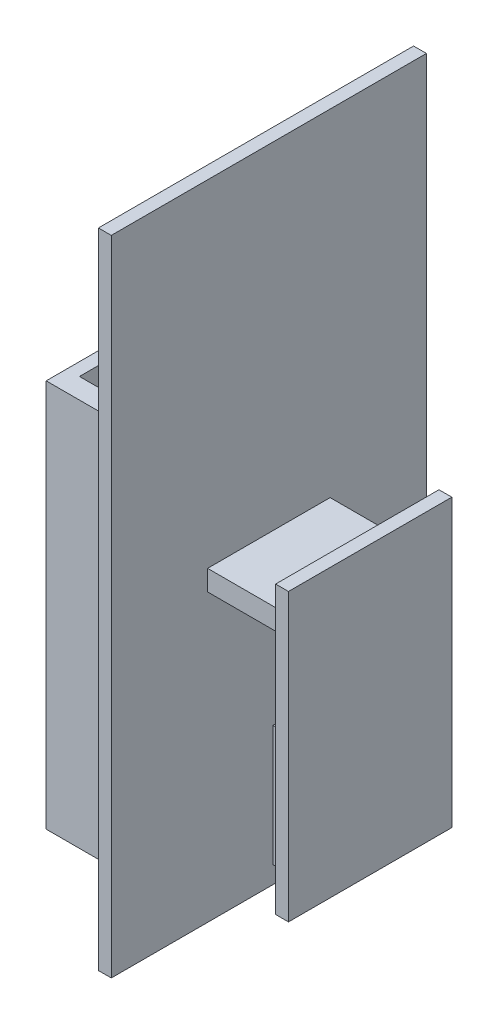
ISO-10303-21;
HEADER;
FILE_DESCRIPTION(('STEP AP214'),'2;1');
FILE_NAME('part.step','',(''),(''),'','','');
FILE_SCHEMA(('AUTOMOTIVE_DESIGN { 1 0 10303 214 1 1 1 1 }'));
ENDSEC;
DATA;
#1=APPLICATION_CONTEXT('core data for automotive mechanical design processes');
#2=APPLICATION_PROTOCOL_DEFINITION('international standard','automotive_design',2000,#1);
#3=PRODUCT_CONTEXT('',#1,'mechanical');
#4=PRODUCT('Part','Part','',(#3));
#5=PRODUCT_RELATED_PRODUCT_CATEGORY('part','',(#4));
#6=PRODUCT_DEFINITION_FORMATION('','',#4);
#7=PRODUCT_DEFINITION_CONTEXT('part definition',#1,'design');
#8=PRODUCT_DEFINITION('design','',#6,#7);
#9=PRODUCT_DEFINITION_SHAPE('','',#8);
#10=(LENGTH_UNIT() NAMED_UNIT(*) SI_UNIT(.MILLI.,.METRE.));
#11=(NAMED_UNIT(*) PLANE_ANGLE_UNIT() SI_UNIT($,.RADIAN.));
#12=(NAMED_UNIT(*) SI_UNIT($,.STERADIAN.) SOLID_ANGLE_UNIT());
#13=UNCERTAINTY_MEASURE_WITH_UNIT(LENGTH_MEASURE(1.E-05),#10,'distance_accuracy_value','');
#14=(GEOMETRIC_REPRESENTATION_CONTEXT(3) GLOBAL_UNCERTAINTY_ASSIGNED_CONTEXT((#13)) GLOBAL_UNIT_ASSIGNED_CONTEXT((#10,
#11,#12)) REPRESENTATION_CONTEXT('',''));
#15=CARTESIAN_POINT('',(0.,0.,0.));
#16=DIRECTION('',(0.,0.,1.));
#17=DIRECTION('',(1.,0.,0.));
#18=AXIS2_PLACEMENT_3D('',#15,#16,#17);
#19=CARTESIAN_POINT('',(-0.8,0.,0.));
#20=DIRECTION('',(1.,0.,0.));
#21=DIRECTION('',(0.,0.,-1.));
#22=AXIS2_PLACEMENT_3D('',#19,#20,#21);
#23=PLANE('',#22);
#24=DIRECTION('',(0.,-1.,0.));
#25=VECTOR('',#24,1.);
#26=CARTESIAN_POINT('',(-0.8,0.,10.16));
#27=LINE('',#26,#25);
#28=CARTESIAN_POINT('',(-0.8,13.38,10.16));
#29=VERTEX_POINT('',#28);
#30=CARTESIAN_POINT('',(-0.8,-34.92,10.16));
#31=VERTEX_POINT('',#30);
#32=EDGE_CURVE('E436',#29,#31,#27,.T.);
#33=ORIENTED_EDGE('',*,*,#32,.F.);
#34=DIRECTION('',(0.,0.,-1.));
#35=VECTOR('',#34,1.);
#36=CARTESIAN_POINT('',(-0.8,13.38,0.));
#37=LINE('',#36,#35);
#38=CARTESIAN_POINT('',(-0.8,13.38,12.7));
#39=VERTEX_POINT('',#38);
#40=EDGE_CURVE('E430',#39,#29,#37,.T.);
#41=ORIENTED_EDGE('',*,*,#40,.F.);
#42=DIRECTION('',(0.,-1.,0.));
#43=VECTOR('',#42,1.);
#44=CARTESIAN_POINT('',(-0.8,0.,12.7));
#45=LINE('',#44,#43);
#46=CARTESIAN_POINT('',(-0.8,-34.92,12.7));
#47=VERTEX_POINT('',#46);
#48=EDGE_CURVE('E433',#39,#47,#45,.T.);
#49=ORIENTED_EDGE('',*,*,#48,.T.);
#50=DIRECTION('',(0.,0.,-1.));
#51=VECTOR('',#50,1.);
#52=CARTESIAN_POINT('',(-0.8,-34.92,0.));
#53=LINE('',#52,#51);
#54=EDGE_CURVE('E58',#47,#31,#53,.T.);
#55=ORIENTED_EDGE('',*,*,#54,.T.);
#56=EDGE_LOOP('',(#33,#41,#49,#55));
#57=FACE_BOUND('',#56,.T.);
#58=DIRECTION('',(0.,0.,-1.));
#59=VECTOR('',#58,1.);
#60=CARTESIAN_POINT('',(-0.8,-40.,19.6));
#61=LINE('',#60,#59);
#62=CARTESIAN_POINT('',(-0.8,-40.,19.6));
#63=VERTEX_POINT('',#62);
#64=CARTESIAN_POINT('',(-0.8,-40.,-19.6));
#65=VERTEX_POINT('',#64);
#66=EDGE_CURVE('E402',#63,#65,#61,.T.);
#67=ORIENTED_EDGE('',*,*,#66,.F.);
#68=DIRECTION('',(0.,1.,0.));
#69=VECTOR('',#68,1.);
#70=CARTESIAN_POINT('',(-0.8,-40.,19.6));
#71=LINE('',#70,#69);
#72=CARTESIAN_POINT('',(-0.8,40.,19.6));
#73=VERTEX_POINT('',#72);
#74=EDGE_CURVE('E410',#63,#73,#71,.T.);
#75=ORIENTED_EDGE('',*,*,#74,.T.);
#76=DIRECTION('',(0.,0.,-1.));
#77=VECTOR('',#76,1.);
#78=CARTESIAN_POINT('',(-0.8,40.,19.6));
#79=LINE('',#78,#77);
#80=CARTESIAN_POINT('',(-0.8,40.,-19.6));
#81=VERTEX_POINT('',#80);
#82=EDGE_CURVE('E408',#73,#81,#79,.T.);
#83=ORIENTED_EDGE('',*,*,#82,.T.);
#84=DIRECTION('',(0.,1.,0.));
#85=VECTOR('',#84,1.);
#86=CARTESIAN_POINT('',(-0.8,-40.,-19.6));
#87=LINE('',#86,#85);
#88=EDGE_CURVE('E405',#65,#81,#87,.T.);
#89=ORIENTED_EDGE('',*,*,#88,.F.);
#90=EDGE_LOOP('',(#67,#75,#83,#89));
#91=FACE_BOUND('',#90,.T.);
#92=DIRECTION('',(0.,0.,-1.));
#93=VECTOR('',#92,1.);
#94=CARTESIAN_POINT('',(-0.8,13.38,0.));
#95=LINE('',#94,#93);
#96=CARTESIAN_POINT('',(-0.8,13.38,-10.16));
#97=VERTEX_POINT('',#96);
#98=CARTESIAN_POINT('',(-0.8,13.38,-12.7));
#99=VERTEX_POINT('',#98);
#100=EDGE_CURVE('E11',#97,#99,#95,.T.);
#101=ORIENTED_EDGE('',*,*,#100,.F.);
#102=DIRECTION('',(0.,-1.,0.));
#103=VECTOR('',#102,1.);
#104=CARTESIAN_POINT('',(-0.8,0.,-10.16));
#105=LINE('',#104,#103);
#106=CARTESIAN_POINT('',(-0.8,-34.92,-10.16));
#107=VERTEX_POINT('',#106);
#108=EDGE_CURVE('E438',#97,#107,#105,.T.);
#109=ORIENTED_EDGE('',*,*,#108,.T.);
#110=DIRECTION('',(0.,0.,-1.));
#111=VECTOR('',#110,1.);
#112=CARTESIAN_POINT('',(-0.8,-34.92,0.));
#113=LINE('',#112,#111);
#114=CARTESIAN_POINT('',(-0.8,-34.92,-12.7));
#115=VERTEX_POINT('',#114);
#116=EDGE_CURVE('E441',#107,#115,#113,.T.);
#117=ORIENTED_EDGE('',*,*,#116,.T.);
#118=DIRECTION('',(0.,-1.,0.));
#119=VECTOR('',#118,1.);
#120=CARTESIAN_POINT('',(-0.8,0.,-12.7));
#121=LINE('',#120,#119);
#122=EDGE_CURVE('E43',#99,#115,#121,.T.);
#123=ORIENTED_EDGE('',*,*,#122,.F.);
#124=EDGE_LOOP('',(#101,#109,#117,#123));
#125=FACE_BOUND('',#124,.T.);
#126=ADVANCED_FACE('F35',(#57,#91,#125),#23,.F.);
#127=CARTESIAN_POINT('',(11.8,0.,0.));
#128=DIRECTION('',(1.,0.,0.));
#129=DIRECTION('',(0.,0.,-1.));
#130=AXIS2_PLACEMENT_3D('',#127,#128,#129);
#131=PLANE('',#130);
#132=DIRECTION('',(0.,-1.,0.));
#133=VECTOR('',#132,1.);
#134=CARTESIAN_POINT('',(11.8,0.,10.16));
#135=LINE('',#134,#133);
#136=CARTESIAN_POINT('',(11.8,3.21999999999999,10.16));
#137=VERTEX_POINT('',#136);
#138=CARTESIAN_POINT('',(11.8,-32.38,10.16));
#139=VERTEX_POINT('',#138);
#140=EDGE_CURVE('E338',#137,#139,#135,.T.);
#141=ORIENTED_EDGE('',*,*,#140,.F.);
#142=DIRECTION('',(0.,0.,1.));
#143=VECTOR('',#142,1.);
#144=CARTESIAN_POINT('',(11.8,3.21999999999999,0.));
#145=LINE('',#144,#143);
#146=CARTESIAN_POINT('',(11.8,3.21999999999999,-10.16));
#147=VERTEX_POINT('',#146);
#148=EDGE_CURVE('E342',#147,#137,#145,.T.);
#149=ORIENTED_EDGE('',*,*,#148,.F.);
#150=DIRECTION('',(0.,-1.,0.));
#151=VECTOR('',#150,1.);
#152=CARTESIAN_POINT('',(11.8,0.,-10.16));
#153=LINE('',#152,#151);
#154=CARTESIAN_POINT('',(11.8,-32.38,-10.16));
#155=VERTEX_POINT('',#154);
#156=EDGE_CURVE('E356',#147,#155,#153,.T.);
#157=ORIENTED_EDGE('',*,*,#156,.T.);
#158=DIRECTION('',(0.,0.,1.));
#159=VECTOR('',#158,1.);
#160=CARTESIAN_POINT('',(11.8,-32.38,0.));
#161=LINE('',#160,#159);
#162=EDGE_CURVE('E353',#155,#139,#161,.T.);
#163=ORIENTED_EDGE('',*,*,#162,.T.);
#164=EDGE_LOOP('',(#141,#149,#157,#163));
#165=FACE_BOUND('',#164,.T.);
#166=DIRECTION('',(0.,0.,-1.));
#167=VECTOR('',#166,1.);
#168=CARTESIAN_POINT('',(11.8,-1.86000000000001,7.61999999999999));
#169=LINE('',#168,#167);
#170=CARTESIAN_POINT('',(11.8,-1.86000000000001,7.61999999999999));
#171=VERTEX_POINT('',#170);
#172=CARTESIAN_POINT('',(11.8,-1.86000000000001,-7.62000000000001));
#173=VERTEX_POINT('',#172);
#174=EDGE_CURVE('E368',#171,#173,#169,.T.);
#175=ORIENTED_EDGE('',*,*,#174,.F.);
#176=DIRECTION('',(0.,-1.,0.));
#177=VECTOR('',#176,1.);
#178=CARTESIAN_POINT('',(11.8,-1.86000000000001,7.61999999999999));
#179=LINE('',#178,#177);
#180=CARTESIAN_POINT('',(11.8,-4.40000000000001,7.61999999999999));
#181=VERTEX_POINT('',#180);
#182=EDGE_CURVE('E376',#171,#181,#179,.T.);
#183=ORIENTED_EDGE('',*,*,#182,.T.);
#184=DIRECTION('',(0.,0.,-1.));
#185=VECTOR('',#184,1.);
#186=CARTESIAN_POINT('',(11.8,-4.40000000000001,7.61999999999999));
#187=LINE('',#186,#185);
#188=CARTESIAN_POINT('',(11.8,-4.40000000000001,-7.62000000000001));
#189=VERTEX_POINT('',#188);
#190=EDGE_CURVE('E374',#181,#189,#187,.T.);
#191=ORIENTED_EDGE('',*,*,#190,.T.);
#192=DIRECTION('',(0.,-1.,0.));
#193=VECTOR('',#192,1.);
#194=CARTESIAN_POINT('',(11.8,-1.86000000000001,-7.62000000000001));
#195=LINE('',#194,#193);
#196=EDGE_CURVE('E371',#173,#189,#195,.T.);
#197=ORIENTED_EDGE('',*,*,#196,.F.);
#198=EDGE_LOOP('',(#175,#183,#191,#197));
#199=FACE_BOUND('',#198,.T.);
#200=DIRECTION('',(0.,0.,-1.));
#201=VECTOR('',#200,1.);
#202=CARTESIAN_POINT('',(11.8,-14.84,7.49999999999999));
#203=LINE('',#202,#201);
#204=CARTESIAN_POINT('',(11.8,-14.84,7.49999999999999));
#205=VERTEX_POINT('',#204);
#206=CARTESIAN_POINT('',(11.8,-14.84,-7.50000000000001));
#207=VERTEX_POINT('',#206);
#208=EDGE_CURVE('E298',#205,#207,#203,.T.);
#209=ORIENTED_EDGE('',*,*,#208,.F.);
#210=DIRECTION('',(0.,-1.,0.));
#211=VECTOR('',#210,1.);
#212=CARTESIAN_POINT('',(11.8,-14.84,7.49999999999999));
#213=LINE('',#212,#211);
#214=CARTESIAN_POINT('',(11.8,-29.84,7.49999999999999));
#215=VERTEX_POINT('',#214);
#216=EDGE_CURVE('E311',#205,#215,#213,.T.);
#217=ORIENTED_EDGE('',*,*,#216,.T.);
#218=DIRECTION('',(0.,0.,-1.));
#219=VECTOR('',#218,1.);
#220=CARTESIAN_POINT('',(11.8,-29.84,7.49999999999999));
#221=LINE('',#220,#219);
#222=CARTESIAN_POINT('',(11.8,-29.84,-7.50000000000001));
#223=VERTEX_POINT('',#222);
#224=EDGE_CURVE('E325',#215,#223,#221,.T.);
#225=ORIENTED_EDGE('',*,*,#224,.T.);
#226=DIRECTION('',(0.,-1.,0.));
#227=VECTOR('',#226,1.);
#228=CARTESIAN_POINT('',(11.8,-14.84,-7.50000000000001));
#229=LINE('',#228,#227);
#230=EDGE_CURVE('E322',#207,#223,#229,.T.);
#231=ORIENTED_EDGE('',*,*,#230,.F.);
#232=EDGE_LOOP('',(#209,#217,#225,#231));
#233=FACE_BOUND('',#232,.T.);
#234=ADVANCED_FACE('F484',(#165,#199,#233),#131,.F.);
#235=CARTESIAN_POINT('',(-0.8,-40.,19.6));
#236=DIRECTION('',(0.,-1.,0.));
#237=DIRECTION('',(0.,0.,-1.));
#238=AXIS2_PLACEMENT_3D('',#235,#236,#237);
#239=PLANE('',#238);
#240=DIRECTION('',(1.,0.,0.));
#241=VECTOR('',#240,1.);
#242=CARTESIAN_POINT('',(-0.8,-40.,-19.6));
#243=LINE('',#242,#241);
#244=CARTESIAN_POINT('',(0.8,-40.,-19.6));
#245=VERTEX_POINT('',#244);
#246=EDGE_CURVE('E412',#65,#245,#243,.T.);
#247=ORIENTED_EDGE('',*,*,#246,.T.);
#248=DIRECTION('',(0.,0.,-1.));
#249=VECTOR('',#248,1.);
#250=CARTESIAN_POINT('',(0.8,-40.,19.6));
#251=LINE('',#250,#249);
#252=CARTESIAN_POINT('',(0.8,-40.,19.6));
#253=VERTEX_POINT('',#252);
#254=EDGE_CURVE('E382',#253,#245,#251,.T.);
#255=ORIENTED_EDGE('',*,*,#254,.F.);
#256=DIRECTION('',(1.,0.,0.));
#257=VECTOR('',#256,1.);
#258=CARTESIAN_POINT('',(-0.8,-40.,19.6));
#259=LINE('',#258,#257);
#260=EDGE_CURVE('E413',#63,#253,#259,.T.);
#261=ORIENTED_EDGE('',*,*,#260,.F.);
#262=ORIENTED_EDGE('',*,*,#66,.T.);
#263=EDGE_LOOP('',(#247,#255,#261,#262));
#264=FACE_BOUND('',#263,.T.);
#265=ADVANCED_FACE('F37',(#264),#239,.T.);
#266=CARTESIAN_POINT('',(-0.8,-40.,19.6));
#267=DIRECTION('',(0.,0.,-1.));
#268=DIRECTION('',(-1.,0.,0.));
#269=AXIS2_PLACEMENT_3D('',#266,#267,#268);
#270=PLANE('',#269);
#271=ORIENTED_EDGE('',*,*,#260,.T.);
#272=DIRECTION('',(0.,1.,0.));
#273=VECTOR('',#272,1.);
#274=CARTESIAN_POINT('',(0.8,-40.,19.6));
#275=LINE('',#274,#273);
#276=CARTESIAN_POINT('',(0.8,40.,19.6));
#277=VERTEX_POINT('',#276);
#278=EDGE_CURVE('E399',#253,#277,#275,.T.);
#279=ORIENTED_EDGE('',*,*,#278,.T.);
#280=DIRECTION('',(1.,0.,0.));
#281=VECTOR('',#280,1.);
#282=CARTESIAN_POINT('',(-0.8,40.,19.6));
#283=LINE('',#282,#281);
#284=EDGE_CURVE('E416',#73,#277,#283,.T.);
#285=ORIENTED_EDGE('',*,*,#284,.F.);
#286=ORIENTED_EDGE('',*,*,#74,.F.);
#287=EDGE_LOOP('',(#271,#279,#285,#286));
#288=FACE_BOUND('',#287,.T.);
#289=ADVANCED_FACE('F495',(#288),#270,.F.);
#290=CARTESIAN_POINT('',(-0.8,40.,19.6));
#291=DIRECTION('',(0.,-1.,0.));
#292=DIRECTION('',(0.,0.,-1.));
#293=AXIS2_PLACEMENT_3D('',#290,#291,#292);
#294=PLANE('',#293);
#295=ORIENTED_EDGE('',*,*,#284,.T.);
#296=DIRECTION('',(0.,0.,-1.));
#297=VECTOR('',#296,1.);
#298=CARTESIAN_POINT('',(0.8,40.,19.6));
#299=LINE('',#298,#297);
#300=CARTESIAN_POINT('',(0.8,40.,-19.6));
#301=VERTEX_POINT('',#300);
#302=EDGE_CURVE('E396',#277,#301,#299,.T.);
#303=ORIENTED_EDGE('',*,*,#302,.T.);
#304=DIRECTION('',(1.,0.,0.));
#305=VECTOR('',#304,1.);
#306=CARTESIAN_POINT('',(-0.8,40.,-19.6));
#307=LINE('',#306,#305);
#308=EDGE_CURVE('E418',#81,#301,#307,.T.);
#309=ORIENTED_EDGE('',*,*,#308,.F.);
#310=ORIENTED_EDGE('',*,*,#82,.F.);
#311=EDGE_LOOP('',(#295,#303,#309,#310));
#312=FACE_BOUND('',#311,.T.);
#313=ADVANCED_FACE('F498',(#312),#294,.F.);
#314=CARTESIAN_POINT('',(-0.8,-40.,-19.6));
#315=DIRECTION('',(0.,0.,-1.));
#316=DIRECTION('',(-1.,0.,0.));
#317=AXIS2_PLACEMENT_3D('',#314,#315,#316);
#318=PLANE('',#317);
#319=ORIENTED_EDGE('',*,*,#308,.T.);
#320=DIRECTION('',(0.,1.,0.));
#321=VECTOR('',#320,1.);
#322=CARTESIAN_POINT('',(0.8,-40.,-19.6));
#323=LINE('',#322,#321);
#324=EDGE_CURVE('E393',#245,#301,#323,.T.);
#325=ORIENTED_EDGE('',*,*,#324,.F.);
#326=ORIENTED_EDGE('',*,*,#246,.F.);
#327=ORIENTED_EDGE('',*,*,#88,.T.);
#328=EDGE_LOOP('',(#319,#325,#326,#327));
#329=FACE_BOUND('',#328,.T.);
#330=ADVANCED_FACE('F501',(#329),#318,.T.);
#331=CARTESIAN_POINT('',(0.8,0.,0.));
#332=DIRECTION('',(1.,0.,0.));
#333=DIRECTION('',(0.,0.,-1.));
#334=AXIS2_PLACEMENT_3D('',#331,#332,#333);
#335=PLANE('',#334);
#336=DIRECTION('',(0.,0.,1.));
#337=VECTOR('',#336,1.);
#338=CARTESIAN_POINT('',(0.8,-1.86000000000001,0.));
#339=LINE('',#338,#337);
#340=CARTESIAN_POINT('',(0.8,-1.86000000000001,-7.62000000000001));
#341=VERTEX_POINT('',#340);
#342=CARTESIAN_POINT('',(0.8,-1.86000000000001,7.61999999999999));
#343=VERTEX_POINT('',#342);
#344=EDGE_CURVE('E427',#341,#343,#339,.T.);
#345=ORIENTED_EDGE('',*,*,#344,.F.);
#346=DIRECTION('',(0.,1.,0.));
#347=VECTOR('',#346,1.);
#348=CARTESIAN_POINT('',(0.8,0.,-7.62000000000001));
#349=LINE('',#348,#347);
#350=CARTESIAN_POINT('',(0.8,-4.40000000000001,-7.62000000000001));
#351=VERTEX_POINT('',#350);
#352=EDGE_CURVE('E415',#351,#341,#349,.T.);
#353=ORIENTED_EDGE('',*,*,#352,.F.);
#354=DIRECTION('',(0.,0.,1.));
#355=VECTOR('',#354,1.);
#356=CARTESIAN_POINT('',(0.8,-4.40000000000001,0.));
#357=LINE('',#356,#355);
#358=CARTESIAN_POINT('',(0.8,-4.40000000000001,7.61999999999999));
#359=VERTEX_POINT('',#358);
#360=EDGE_CURVE('E423',#351,#359,#357,.T.);
#361=ORIENTED_EDGE('',*,*,#360,.T.);
#362=DIRECTION('',(0.,1.,0.));
#363=VECTOR('',#362,1.);
#364=CARTESIAN_POINT('',(0.8,0.,7.61999999999999));
#365=LINE('',#364,#363);
#366=EDGE_CURVE('E425',#359,#343,#365,.T.);
#367=ORIENTED_EDGE('',*,*,#366,.T.);
#368=EDGE_LOOP('',(#345,#353,#361,#367));
#369=FACE_BOUND('',#368,.T.);
#370=ORIENTED_EDGE('',*,*,#254,.T.);
#371=ORIENTED_EDGE('',*,*,#324,.T.);
#372=ORIENTED_EDGE('',*,*,#302,.F.);
#373=ORIENTED_EDGE('',*,*,#278,.F.);
#374=EDGE_LOOP('',(#370,#371,#372,#373));
#375=FACE_BOUND('',#374,.T.);
#376=ADVANCED_FACE('F493',(#369,#375),#335,.T.);
#377=CARTESIAN_POINT('',(11.8,-1.86000000000001,7.61999999999999));
#378=DIRECTION('',(0.,1.,0.));
#379=DIRECTION('',(0.,0.,1.));
#380=AXIS2_PLACEMENT_3D('',#377,#378,#379);
#381=PLANE('',#380);
#382=DIRECTION('',(-1.,0.,0.));
#383=VECTOR('',#382,1.);
#384=CARTESIAN_POINT('',(11.8,-1.86000000000001,-7.62000000000001));
#385=LINE('',#384,#383);
#386=EDGE_CURVE('E378',#173,#341,#385,.T.);
#387=ORIENTED_EDGE('',*,*,#386,.T.);
#388=ORIENTED_EDGE('',*,*,#344,.T.);
#389=DIRECTION('',(-1.,0.,0.));
#390=VECTOR('',#389,1.);
#391=CARTESIAN_POINT('',(11.8,-1.86000000000001,7.61999999999999));
#392=LINE('',#391,#390);
#393=EDGE_CURVE('E379',#171,#343,#392,.T.);
#394=ORIENTED_EDGE('',*,*,#393,.F.);
#395=ORIENTED_EDGE('',*,*,#174,.T.);
#396=EDGE_LOOP('',(#387,#388,#394,#395));
#397=FACE_BOUND('',#396,.T.);
#398=ADVANCED_FACE('F508',(#397),#381,.T.);
#399=CARTESIAN_POINT('',(11.8,-1.86000000000001,7.61999999999999));
#400=DIRECTION('',(0.,0.,-1.));
#401=DIRECTION('',(-1.,0.,0.));
#402=AXIS2_PLACEMENT_3D('',#399,#400,#401);
#403=PLANE('',#402);
#404=ORIENTED_EDGE('',*,*,#366,.F.);
#405=DIRECTION('',(-1.,0.,0.));
#406=VECTOR('',#405,1.);
#407=CARTESIAN_POINT('',(11.8,-4.40000000000001,7.61999999999999));
#408=LINE('',#407,#406);
#409=EDGE_CURVE('E383',#181,#359,#408,.T.);
#410=ORIENTED_EDGE('',*,*,#409,.F.);
#411=ORIENTED_EDGE('',*,*,#182,.F.);
#412=ORIENTED_EDGE('',*,*,#393,.T.);
#413=EDGE_LOOP('',(#404,#410,#411,#412));
#414=FACE_BOUND('',#413,.T.);
#415=ADVANCED_FACE('F554',(#414),#403,.F.);
#416=CARTESIAN_POINT('',(11.8,-4.40000000000001,7.61999999999999));
#417=DIRECTION('',(0.,1.,0.));
#418=DIRECTION('',(0.,0.,1.));
#419=AXIS2_PLACEMENT_3D('',#416,#417,#418);
#420=PLANE('',#419);
#421=ORIENTED_EDGE('',*,*,#360,.F.);
#422=DIRECTION('',(-1.,0.,0.));
#423=VECTOR('',#422,1.);
#424=CARTESIAN_POINT('',(11.8,-4.40000000000001,-7.62000000000001));
#425=LINE('',#424,#423);
#426=EDGE_CURVE('E386',#189,#351,#425,.T.);
#427=ORIENTED_EDGE('',*,*,#426,.F.);
#428=ORIENTED_EDGE('',*,*,#190,.F.);
#429=ORIENTED_EDGE('',*,*,#409,.T.);
#430=EDGE_LOOP('',(#421,#427,#428,#429));
#431=FACE_BOUND('',#430,.T.);
#432=ADVANCED_FACE('F563',(#431),#420,.F.);
#433=CARTESIAN_POINT('',(11.8,-1.86000000000001,-7.62000000000001));
#434=DIRECTION('',(0.,0.,-1.));
#435=DIRECTION('',(-1.,0.,0.));
#436=AXIS2_PLACEMENT_3D('',#433,#434,#435);
#437=PLANE('',#436);
#438=ORIENTED_EDGE('',*,*,#426,.T.);
#439=ORIENTED_EDGE('',*,*,#352,.T.);
#440=ORIENTED_EDGE('',*,*,#386,.F.);
#441=ORIENTED_EDGE('',*,*,#196,.T.);
#442=EDGE_LOOP('',(#438,#439,#440,#441));
#443=FACE_BOUND('',#442,.T.);
#444=ADVANCED_FACE('F573',(#443),#437,.T.);
#445=CARTESIAN_POINT('',(13.4,0.,10.16));
#446=DIRECTION('',(0.,0.,-1.));
#447=DIRECTION('',(0.,1.,0.));
#448=AXIS2_PLACEMENT_3D('',#445,#446,#447);
#449=PLANE('',#448);
#450=ORIENTED_EDGE('',*,*,#140,.T.);
#451=DIRECTION('',(-1.,0.,0.));
#452=VECTOR('',#451,1.);
#453=CARTESIAN_POINT('',(13.4,-32.38,10.16));
#454=LINE('',#453,#452);
#455=CARTESIAN_POINT('',(13.4,-32.38,10.16));
#456=VERTEX_POINT('',#455);
#457=EDGE_CURVE('E366',#456,#139,#454,.T.);
#458=ORIENTED_EDGE('',*,*,#457,.F.);
#459=DIRECTION('',(0.,-1.,0.));
#460=VECTOR('',#459,1.);
#461=CARTESIAN_POINT('',(13.4,0.,10.16));
#462=LINE('',#461,#460);
#463=CARTESIAN_POINT('',(13.4,3.21999999999999,10.16));
#464=VERTEX_POINT('',#463);
#465=EDGE_CURVE('E339',#464,#456,#462,.T.);
#466=ORIENTED_EDGE('',*,*,#465,.F.);
#467=DIRECTION('',(-1.,0.,0.));
#468=VECTOR('',#467,1.);
#469=CARTESIAN_POINT('',(13.4,3.21999999999999,10.16));
#470=LINE('',#469,#468);
#471=EDGE_CURVE('E350',#464,#137,#470,.T.);
#472=ORIENTED_EDGE('',*,*,#471,.T.);
#473=EDGE_LOOP('',(#450,#458,#466,#472));
#474=FACE_BOUND('',#473,.T.);
#475=ADVANCED_FACE('F583',(#474),#449,.F.);
#476=CARTESIAN_POINT('',(13.4,-32.38,0.));
#477=DIRECTION('',(0.,-1.,0.));
#478=DIRECTION('',(0.,0.,-1.));
#479=AXIS2_PLACEMENT_3D('',#476,#477,#478);
#480=PLANE('',#479);
#481=ORIENTED_EDGE('',*,*,#162,.F.);
#482=DIRECTION('',(-1.,0.,0.));
#483=VECTOR('',#482,1.);
#484=CARTESIAN_POINT('',(13.4,-32.38,-10.16));
#485=LINE('',#484,#483);
#486=CARTESIAN_POINT('',(13.4,-32.38,-10.16));
#487=VERTEX_POINT('',#486);
#488=EDGE_CURVE('E364',#487,#155,#485,.T.);
#489=ORIENTED_EDGE('',*,*,#488,.F.);
#490=DIRECTION('',(0.,0.,1.));
#491=VECTOR('',#490,1.);
#492=CARTESIAN_POINT('',(13.4,-32.38,0.));
#493=LINE('',#492,#491);
#494=EDGE_CURVE('E341',#487,#456,#493,.T.);
#495=ORIENTED_EDGE('',*,*,#494,.T.);
#496=ORIENTED_EDGE('',*,*,#457,.T.);
#497=EDGE_LOOP('',(#481,#489,#495,#496));
#498=FACE_BOUND('',#497,.T.);
#499=ADVANCED_FACE('F594',(#498),#480,.T.);
#500=CARTESIAN_POINT('',(13.4,0.,-10.16));
#501=DIRECTION('',(0.,0.,-1.));
#502=DIRECTION('',(0.,1.,0.));
#503=AXIS2_PLACEMENT_3D('',#500,#501,#502);
#504=PLANE('',#503);
#505=ORIENTED_EDGE('',*,*,#156,.F.);
#506=DIRECTION('',(-1.,0.,0.));
#507=VECTOR('',#506,1.);
#508=CARTESIAN_POINT('',(13.4,3.21999999999999,-10.16));
#509=LINE('',#508,#507);
#510=CARTESIAN_POINT('',(13.4,3.21999999999999,-10.16));
#511=VERTEX_POINT('',#510);
#512=EDGE_CURVE('E362',#511,#147,#509,.T.);
#513=ORIENTED_EDGE('',*,*,#512,.F.);
#514=DIRECTION('',(0.,-1.,0.));
#515=VECTOR('',#514,1.);
#516=CARTESIAN_POINT('',(13.4,0.,-10.16));
#517=LINE('',#516,#515);
#518=EDGE_CURVE('E345',#511,#487,#517,.T.);
#519=ORIENTED_EDGE('',*,*,#518,.T.);
#520=ORIENTED_EDGE('',*,*,#488,.T.);
#521=EDGE_LOOP('',(#505,#513,#519,#520));
#522=FACE_BOUND('',#521,.T.);
#523=ADVANCED_FACE('F604',(#522),#504,.T.);
#524=CARTESIAN_POINT('',(13.4,3.21999999999999,0.));
#525=DIRECTION('',(0.,-1.,0.));
#526=DIRECTION('',(0.,0.,-1.));
#527=AXIS2_PLACEMENT_3D('',#524,#525,#526);
#528=PLANE('',#527);
#529=ORIENTED_EDGE('',*,*,#148,.T.);
#530=ORIENTED_EDGE('',*,*,#471,.F.);
#531=DIRECTION('',(0.,0.,1.));
#532=VECTOR('',#531,1.);
#533=CARTESIAN_POINT('',(13.4,3.21999999999999,0.));
#534=LINE('',#533,#532);
#535=EDGE_CURVE('E348',#511,#464,#534,.T.);
#536=ORIENTED_EDGE('',*,*,#535,.F.);
#537=ORIENTED_EDGE('',*,*,#512,.T.);
#538=EDGE_LOOP('',(#529,#530,#536,#537));
#539=FACE_BOUND('',#538,.T.);
#540=ADVANCED_FACE('F615',(#539),#528,.F.);
#541=CARTESIAN_POINT('',(13.4,0.,0.));
#542=DIRECTION('',(1.,0.,0.));
#543=DIRECTION('',(0.,0.,-1.));
#544=AXIS2_PLACEMENT_3D('',#541,#542,#543);
#545=PLANE('',#544);
#546=ORIENTED_EDGE('',*,*,#465,.T.);
#547=ORIENTED_EDGE('',*,*,#494,.F.);
#548=ORIENTED_EDGE('',*,*,#518,.F.);
#549=ORIENTED_EDGE('',*,*,#535,.T.);
#550=EDGE_LOOP('',(#546,#547,#548,#549));
#551=FACE_BOUND('',#550,.T.);
#552=ADVANCED_FACE('F625',(#551),#545,.T.);
#553=CARTESIAN_POINT('',(8.8,-14.84,7.49999999999999));
#554=DIRECTION('',(0.,-1.,0.));
#555=DIRECTION('',(0.,0.,-1.));
#556=AXIS2_PLACEMENT_3D('',#553,#554,#555);
#557=PLANE('',#556);
#558=ORIENTED_EDGE('',*,*,#208,.T.);
#559=DIRECTION('',(1.,0.,0.));
#560=VECTOR('',#559,1.);
#561=CARTESIAN_POINT('',(8.8,-14.84,-7.50000000000001));
#562=LINE('',#561,#560);
#563=CARTESIAN_POINT('',(8.8,-14.84,-7.50000000000001));
#564=VERTEX_POINT('',#563);
#565=EDGE_CURVE('E336',#564,#207,#562,.T.);
#566=ORIENTED_EDGE('',*,*,#565,.F.);
#567=DIRECTION('',(0.,0.,-1.));
#568=VECTOR('',#567,1.);
#569=CARTESIAN_POINT('',(8.8,-14.84,7.49999999999999));
#570=LINE('',#569,#568);
#571=CARTESIAN_POINT('',(8.8,-14.84,7.49999999999999));
#572=VERTEX_POINT('',#571);
#573=EDGE_CURVE('E307',#572,#564,#570,.T.);
#574=ORIENTED_EDGE('',*,*,#573,.F.);
#575=DIRECTION('',(1.,0.,0.));
#576=VECTOR('',#575,1.);
#577=CARTESIAN_POINT('',(8.8,-14.84,7.49999999999999));
#578=LINE('',#577,#576);
#579=EDGE_CURVE('E319',#572,#205,#578,.T.);
#580=ORIENTED_EDGE('',*,*,#579,.T.);
#581=EDGE_LOOP('',(#558,#566,#574,#580));
#582=FACE_BOUND('',#581,.T.);
#583=ADVANCED_FACE('F635',(#582),#557,.F.);
#584=CARTESIAN_POINT('',(8.8,-14.84,-7.50000000000001));
#585=DIRECTION('',(0.,0.,1.));
#586=DIRECTION('',(0.,-1.,0.));
#587=AXIS2_PLACEMENT_3D('',#584,#585,#586);
#588=PLANE('',#587);
#589=ORIENTED_EDGE('',*,*,#230,.T.);
#590=DIRECTION('',(1.,0.,0.));
#591=VECTOR('',#590,1.);
#592=CARTESIAN_POINT('',(8.8,-29.84,-7.50000000000001));
#593=LINE('',#592,#591);
#594=CARTESIAN_POINT('',(8.8,-29.84,-7.50000000000001));
#595=VERTEX_POINT('',#594);
#596=EDGE_CURVE('E334',#595,#223,#593,.T.);
#597=ORIENTED_EDGE('',*,*,#596,.F.);
#598=DIRECTION('',(0.,-1.,0.));
#599=VECTOR('',#598,1.);
#600=CARTESIAN_POINT('',(8.8,-14.84,-7.50000000000001));
#601=LINE('',#600,#599);
#602=EDGE_CURVE('E310',#564,#595,#601,.T.);
#603=ORIENTED_EDGE('',*,*,#602,.F.);
#604=ORIENTED_EDGE('',*,*,#565,.T.);
#605=EDGE_LOOP('',(#589,#597,#603,#604));
#606=FACE_BOUND('',#605,.T.);
#607=ADVANCED_FACE('F651',(#606),#588,.F.);
#608=CARTESIAN_POINT('',(8.8,-29.84,7.49999999999999));
#609=DIRECTION('',(0.,-1.,0.));
#610=DIRECTION('',(0.,0.,-1.));
#611=AXIS2_PLACEMENT_3D('',#608,#609,#610);
#612=PLANE('',#611);
#613=ORIENTED_EDGE('',*,*,#224,.F.);
#614=DIRECTION('',(1.,0.,0.));
#615=VECTOR('',#614,1.);
#616=CARTESIAN_POINT('',(8.8,-29.84,7.49999999999999));
#617=LINE('',#616,#615);
#618=CARTESIAN_POINT('',(8.8,-29.84,7.49999999999999));
#619=VERTEX_POINT('',#618);
#620=EDGE_CURVE('E331',#619,#215,#617,.T.);
#621=ORIENTED_EDGE('',*,*,#620,.F.);
#622=DIRECTION('',(0.,0.,-1.));
#623=VECTOR('',#622,1.);
#624=CARTESIAN_POINT('',(8.8,-29.84,7.49999999999999));
#625=LINE('',#624,#623);
#626=EDGE_CURVE('E313',#619,#595,#625,.T.);
#627=ORIENTED_EDGE('',*,*,#626,.T.);
#628=ORIENTED_EDGE('',*,*,#596,.T.);
#629=EDGE_LOOP('',(#613,#621,#627,#628));
#630=FACE_BOUND('',#629,.T.);
#631=ADVANCED_FACE('F661',(#630),#612,.T.);
#632=CARTESIAN_POINT('',(8.8,-14.84,7.49999999999999));
#633=DIRECTION('',(0.,0.,1.));
#634=DIRECTION('',(0.,-1.,0.));
#635=AXIS2_PLACEMENT_3D('',#632,#633,#634);
#636=PLANE('',#635);
#637=ORIENTED_EDGE('',*,*,#216,.F.);
#638=ORIENTED_EDGE('',*,*,#579,.F.);
#639=DIRECTION('',(0.,-1.,0.));
#640=VECTOR('',#639,1.);
#641=CARTESIAN_POINT('',(8.8,-14.84,7.49999999999999));
#642=LINE('',#641,#640);
#643=EDGE_CURVE('E316',#572,#619,#642,.T.);
#644=ORIENTED_EDGE('',*,*,#643,.T.);
#645=ORIENTED_EDGE('',*,*,#620,.T.);
#646=EDGE_LOOP('',(#637,#638,#644,#645));
#647=FACE_BOUND('',#646,.T.);
#648=ADVANCED_FACE('F671',(#647),#636,.T.);
#649=CARTESIAN_POINT('',(8.8,0.,0.));
#650=DIRECTION('',(-1.,0.,0.));
#651=DIRECTION('',(0.,0.,1.));
#652=AXIS2_PLACEMENT_3D('',#649,#650,#651);
#653=PLANE('',#652);
#654=ORIENTED_EDGE('',*,*,#573,.T.);
#655=ORIENTED_EDGE('',*,*,#602,.T.);
#656=ORIENTED_EDGE('',*,*,#626,.F.);
#657=ORIENTED_EDGE('',*,*,#643,.F.);
#658=EDGE_LOOP('',(#654,#655,#656,#657));
#659=FACE_BOUND('',#658,.T.);
#660=ADVANCED_FACE('F681',(#659),#653,.T.);
#661=CARTESIAN_POINT('',(-12.6,0.,10.16));
#662=DIRECTION('',(0.,0.,1.));
#663=DIRECTION('',(0.,-1.,0.));
#664=AXIS2_PLACEMENT_3D('',#661,#662,#663);
#665=PLANE('',#664);
#666=DIRECTION('',(1.,0.,0.));
#667=VECTOR('',#666,1.);
#668=CARTESIAN_POINT('',(-12.6,13.38,10.16));
#669=LINE('',#668,#667);
#670=CARTESIAN_POINT('',(-12.6,13.38,10.16));
#671=VERTEX_POINT('',#670);
#672=EDGE_CURVE('E294',#671,#29,#669,.T.);
#673=ORIENTED_EDGE('',*,*,#672,.T.);
#674=ORIENTED_EDGE('',*,*,#32,.T.);
#675=DIRECTION('',(1.,0.,0.));
#676=VECTOR('',#675,1.);
#677=CARTESIAN_POINT('',(-12.6,-34.92,10.16));
#678=LINE('',#677,#676);
#679=CARTESIAN_POINT('',(-12.6,-34.92,10.16));
#680=VERTEX_POINT('',#679);
#681=EDGE_CURVE('E295',#680,#31,#678,.T.);
#682=ORIENTED_EDGE('',*,*,#681,.F.);
#683=DIRECTION('',(0.,-1.,0.));
#684=VECTOR('',#683,1.);
#685=CARTESIAN_POINT('',(-12.6,0.,10.16));
#686=LINE('',#685,#684);
#687=EDGE_CURVE('E285',#671,#680,#686,.T.);
#688=ORIENTED_EDGE('',*,*,#687,.F.);
#689=EDGE_LOOP('',(#673,#674,#682,#688));
#690=FACE_BOUND('',#689,.T.);
#691=ADVANCED_FACE('F462',(#690),#665,.F.);
#692=CARTESIAN_POINT('',(-12.6,-34.92,0.));
#693=DIRECTION('',(0.,-1.,0.));
#694=DIRECTION('',(0.,0.,-1.));
#695=AXIS2_PLACEMENT_3D('',#692,#693,#694);
#696=PLANE('',#695);
#697=ORIENTED_EDGE('',*,*,#54,.F.);
#698=DIRECTION('',(1.,0.,0.));
#699=VECTOR('',#698,1.);
#700=CARTESIAN_POINT('',(-12.6,-34.92,12.7));
#701=LINE('',#700,#699);
#702=CARTESIAN_POINT('',(-14.2,-34.92,12.7));
#703=VERTEX_POINT('',#702);
#704=EDGE_CURVE('E299',#703,#47,#701,.T.);
#705=ORIENTED_EDGE('',*,*,#704,.F.);
#706=DIRECTION('',(0.,0.,-1.));
#707=VECTOR('',#706,1.);
#708=CARTESIAN_POINT('',(-14.2,-34.92,0.));
#709=LINE('',#708,#707);
#710=CARTESIAN_POINT('',(-14.2,-34.92,2.99999999999999));
#711=VERTEX_POINT('',#710);
#712=EDGE_CURVE('E256',#703,#711,#709,.T.);
#713=ORIENTED_EDGE('',*,*,#712,.T.);
#714=DIRECTION('',(1.,0.,0.));
#715=VECTOR('',#714,1.);
#716=CARTESIAN_POINT('',(-17.2,-34.92,2.99999999999999));
#717=LINE('',#716,#715);
#718=CARTESIAN_POINT('',(-17.2,-34.92,2.99999999999999));
#719=VERTEX_POINT('',#718);
#720=EDGE_CURVE('E249',#719,#711,#717,.T.);
#721=ORIENTED_EDGE('',*,*,#720,.F.);
#722=DIRECTION('',(0.,0.,-1.));
#723=VECTOR('',#722,1.);
#724=CARTESIAN_POINT('',(-17.2,-34.92,0.));
#725=LINE('',#724,#723);
#726=CARTESIAN_POINT('',(-17.2,-34.92,-3.00000000000001));
#727=VERTEX_POINT('',#726);
#728=EDGE_CURVE('E244',#719,#727,#725,.T.);
#729=ORIENTED_EDGE('',*,*,#728,.T.);
#730=DIRECTION('',(1.,0.,0.));
#731=VECTOR('',#730,1.);
#732=CARTESIAN_POINT('',(-17.2,-34.92,-3.00000000000001));
#733=LINE('',#732,#731);
#734=CARTESIAN_POINT('',(-14.2,-34.92,-3.00000000000001));
#735=VERTEX_POINT('',#734);
#736=EDGE_CURVE('E251',#727,#735,#733,.T.);
#737=ORIENTED_EDGE('',*,*,#736,.T.);
#738=DIRECTION('',(0.,0.,1.));
#739=VECTOR('',#738,1.);
#740=CARTESIAN_POINT('',(-14.2,-34.92,0.));
#741=LINE('',#740,#739);
#742=CARTESIAN_POINT('',(-14.2,-34.92,-12.7));
#743=VERTEX_POINT('',#742);
#744=EDGE_CURVE('E269',#743,#735,#741,.T.);
#745=ORIENTED_EDGE('',*,*,#744,.F.);
#746=DIRECTION('',(1.,0.,0.));
#747=VECTOR('',#746,1.);
#748=CARTESIAN_POINT('',(-12.6,-34.92,-12.7));
#749=LINE('',#748,#747);
#750=EDGE_CURVE('E286',#743,#115,#749,.T.);
#751=ORIENTED_EDGE('',*,*,#750,.T.);
#752=ORIENTED_EDGE('',*,*,#116,.F.);
#753=DIRECTION('',(1.,0.,0.));
#754=VECTOR('',#753,1.);
#755=CARTESIAN_POINT('',(-12.6,-34.92,-10.16));
#756=LINE('',#755,#754);
#757=CARTESIAN_POINT('',(-12.6,-34.92,-10.16));
#758=VERTEX_POINT('',#757);
#759=EDGE_CURVE('E50',#758,#107,#756,.T.);
#760=ORIENTED_EDGE('',*,*,#759,.F.);
#761=DIRECTION('',(0.,0.,-1.));
#762=VECTOR('',#761,1.);
#763=CARTESIAN_POINT('',(-12.6,-34.92,0.));
#764=LINE('',#763,#762);
#765=EDGE_CURVE('E231',#680,#758,#764,.T.);
#766=ORIENTED_EDGE('',*,*,#765,.F.);
#767=ORIENTED_EDGE('',*,*,#681,.T.);
#768=EDGE_LOOP('',(#697,#705,#713,#721,#729,#737,#745,#751,#752,#760,#766,#767));
#769=FACE_BOUND('',#768,.T.);
#770=ADVANCED_FACE('F451',(#769),#696,.T.);
#771=CARTESIAN_POINT('',(-12.6,0.,12.7));
#772=DIRECTION('',(0.,0.,1.));
#773=DIRECTION('',(0.,-1.,0.));
#774=AXIS2_PLACEMENT_3D('',#771,#772,#773);
#775=PLANE('',#774);
#776=ORIENTED_EDGE('',*,*,#48,.F.);
#777=DIRECTION('',(1.,0.,0.));
#778=VECTOR('',#777,1.);
#779=CARTESIAN_POINT('',(-12.6,13.38,12.7));
#780=LINE('',#779,#778);
#781=CARTESIAN_POINT('',(-14.2,13.38,12.7));
#782=VERTEX_POINT('',#781);
#783=EDGE_CURVE('E302',#782,#39,#780,.T.);
#784=ORIENTED_EDGE('',*,*,#783,.F.);
#785=DIRECTION('',(0.,-1.,0.));
#786=VECTOR('',#785,1.);
#787=CARTESIAN_POINT('',(-14.2,0.,12.7));
#788=LINE('',#787,#786);
#789=EDGE_CURVE('E260',#782,#703,#788,.T.);
#790=ORIENTED_EDGE('',*,*,#789,.T.);
#791=ORIENTED_EDGE('',*,*,#704,.T.);
#792=EDGE_LOOP('',(#776,#784,#790,#791));
#793=FACE_BOUND('',#792,.T.);
#794=ADVANCED_FACE('F468',(#793),#775,.T.);
#795=CARTESIAN_POINT('',(-12.6,13.38,0.));
#796=DIRECTION('',(0.,-1.,0.));
#797=DIRECTION('',(0.,0.,-1.));
#798=AXIS2_PLACEMENT_3D('',#795,#796,#797);
#799=PLANE('',#798);
#800=ORIENTED_EDGE('',*,*,#783,.T.);
#801=ORIENTED_EDGE('',*,*,#40,.T.);
#802=ORIENTED_EDGE('',*,*,#672,.F.);
#803=DIRECTION('',(0.,0.,-1.));
#804=VECTOR('',#803,1.);
#805=CARTESIAN_POINT('',(-12.6,13.38,0.));
#806=LINE('',#805,#804);
#807=CARTESIAN_POINT('',(-12.6,13.38,-10.16));
#808=VERTEX_POINT('',#807);
#809=EDGE_CURVE('E257',#671,#808,#806,.T.);
#810=ORIENTED_EDGE('',*,*,#809,.T.);
#811=DIRECTION('',(1.,0.,0.));
#812=VECTOR('',#811,1.);
#813=CARTESIAN_POINT('',(-12.6,13.38,-10.16));
#814=LINE('',#813,#812);
#815=EDGE_CURVE('E281',#808,#97,#814,.T.);
#816=ORIENTED_EDGE('',*,*,#815,.T.);
#817=ORIENTED_EDGE('',*,*,#100,.T.);
#818=DIRECTION('',(1.,0.,0.));
#819=VECTOR('',#818,1.);
#820=CARTESIAN_POINT('',(-12.6,13.38,-12.7));
#821=LINE('',#820,#819);
#822=CARTESIAN_POINT('',(-14.2,13.38,-12.7));
#823=VERTEX_POINT('',#822);
#824=EDGE_CURVE('E282',#823,#99,#821,.T.);
#825=ORIENTED_EDGE('',*,*,#824,.F.);
#826=DIRECTION('',(0.,0.,-1.));
#827=VECTOR('',#826,1.);
#828=CARTESIAN_POINT('',(-14.2,13.38,0.));
#829=LINE('',#828,#827);
#830=EDGE_CURVE('E263',#782,#823,#829,.T.);
#831=ORIENTED_EDGE('',*,*,#830,.F.);
#832=EDGE_LOOP('',(#800,#801,#802,#810,#816,#817,#825,#831));
#833=FACE_BOUND('',#832,.T.);
#834=ADVANCED_FACE('F455',(#833),#799,.F.);
#835=CARTESIAN_POINT('',(-12.6,0.,-12.7));
#836=DIRECTION('',(0.,0.,1.));
#837=DIRECTION('',(0.,-1.,0.));
#838=AXIS2_PLACEMENT_3D('',#835,#836,#837);
#839=PLANE('',#838);
#840=ORIENTED_EDGE('',*,*,#824,.T.);
#841=ORIENTED_EDGE('',*,*,#122,.T.);
#842=ORIENTED_EDGE('',*,*,#750,.F.);
#843=DIRECTION('',(0.,-1.,0.));
#844=VECTOR('',#843,1.);
#845=CARTESIAN_POINT('',(-14.2,0.,-12.7));
#846=LINE('',#845,#844);
#847=EDGE_CURVE('E266',#823,#743,#846,.T.);
#848=ORIENTED_EDGE('',*,*,#847,.F.);
#849=EDGE_LOOP('',(#840,#841,#842,#848));
#850=FACE_BOUND('',#849,.T.);
#851=ADVANCED_FACE('F445',(#850),#839,.F.);
#852=CARTESIAN_POINT('',(-12.6,0.,-10.16));
#853=DIRECTION('',(0.,0.,1.));
#854=DIRECTION('',(0.,-1.,0.));
#855=AXIS2_PLACEMENT_3D('',#852,#853,#854);
#856=PLANE('',#855);
#857=ORIENTED_EDGE('',*,*,#108,.F.);
#858=ORIENTED_EDGE('',*,*,#815,.F.);
#859=DIRECTION('',(0.,-1.,0.));
#860=VECTOR('',#859,1.);
#861=CARTESIAN_POINT('',(-12.6,0.,-10.16));
#862=LINE('',#861,#860);
#863=EDGE_CURVE('E276',#808,#758,#862,.T.);
#864=ORIENTED_EDGE('',*,*,#863,.T.);
#865=ORIENTED_EDGE('',*,*,#759,.T.);
#866=EDGE_LOOP('',(#857,#858,#864,#865));
#867=FACE_BOUND('',#866,.T.);
#868=ADVANCED_FACE('F453',(#867),#856,.T.);
#869=CARTESIAN_POINT('',(-12.6,0.,0.));
#870=DIRECTION('',(-1.,0.,0.));
#871=DIRECTION('',(0.,0.,1.));
#872=AXIS2_PLACEMENT_3D('',#869,#870,#871);
#873=PLANE('',#872);
#874=ORIENTED_EDGE('',*,*,#765,.T.);
#875=ORIENTED_EDGE('',*,*,#863,.F.);
#876=ORIENTED_EDGE('',*,*,#809,.F.);
#877=ORIENTED_EDGE('',*,*,#687,.T.);
#878=EDGE_LOOP('',(#874,#875,#876,#877));
#879=FACE_BOUND('',#878,.T.);
#880=ADVANCED_FACE('F459',(#879),#873,.F.);
#881=CARTESIAN_POINT('',(-14.2,0.,0.));
#882=DIRECTION('',(-1.,0.,0.));
#883=DIRECTION('',(0.,0.,1.));
#884=AXIS2_PLACEMENT_3D('',#881,#882,#883);
#885=PLANE('',#884);
#886=DIRECTION('',(0.,-1.,0.));
#887=VECTOR('',#886,1.);
#888=CARTESIAN_POINT('',(-14.2,0.,3.));
#889=LINE('',#888,#887);
#890=CARTESIAN_POINT('',(-14.2,-28.92,2.99999999999999));
#891=VERTEX_POINT('',#890);
#892=EDGE_CURVE('E228',#891,#711,#889,.T.);
#893=ORIENTED_EDGE('',*,*,#892,.T.);
#894=ORIENTED_EDGE('',*,*,#712,.F.);
#895=ORIENTED_EDGE('',*,*,#789,.F.);
#896=ORIENTED_EDGE('',*,*,#830,.T.);
#897=ORIENTED_EDGE('',*,*,#847,.T.);
#898=ORIENTED_EDGE('',*,*,#744,.T.);
#899=DIRECTION('',(0.,-1.,0.));
#900=VECTOR('',#899,1.);
#901=CARTESIAN_POINT('',(-14.2,0.,-3.00000000000001));
#902=LINE('',#901,#900);
#903=CARTESIAN_POINT('',(-14.2,-28.92,-3.00000000000001));
#904=VERTEX_POINT('',#903);
#905=EDGE_CURVE('E271',#904,#735,#902,.T.);
#906=ORIENTED_EDGE('',*,*,#905,.F.);
#907=DIRECTION('',(0.,0.,-1.));
#908=VECTOR('',#907,1.);
#909=CARTESIAN_POINT('',(-14.2,-28.92,0.));
#910=LINE('',#909,#908);
#911=EDGE_CURVE('E274',#891,#904,#910,.T.);
#912=ORIENTED_EDGE('',*,*,#911,.F.);
#913=EDGE_LOOP('',(#893,#894,#895,#896,#897,#898,#906,#912));
#914=FACE_BOUND('',#913,.T.);
#915=ADVANCED_FACE('F471',(#914),#885,.T.);
#916=CARTESIAN_POINT('',(-17.2,0.,3.));
#917=DIRECTION('',(0.,0.,1.));
#918=DIRECTION('',(0.,-1.,0.));
#919=AXIS2_PLACEMENT_3D('',#916,#917,#918);
#920=PLANE('',#919);
#921=ORIENTED_EDGE('',*,*,#720,.T.);
#922=ORIENTED_EDGE('',*,*,#892,.F.);
#923=DIRECTION('',(1.,0.,0.));
#924=VECTOR('',#923,1.);
#925=CARTESIAN_POINT('',(-17.2,-28.92,2.99999999999999));
#926=LINE('',#925,#924);
#927=CARTESIAN_POINT('',(-17.2,-28.92,2.99999999999999));
#928=VERTEX_POINT('',#927);
#929=EDGE_CURVE('E221',#928,#891,#926,.T.);
#930=ORIENTED_EDGE('',*,*,#929,.F.);
#931=DIRECTION('',(0.,-1.,0.));
#932=VECTOR('',#931,1.);
#933=CARTESIAN_POINT('',(-17.2,0.,3.));
#934=LINE('',#933,#932);
#935=EDGE_CURVE('E226',#928,#719,#934,.T.);
#936=ORIENTED_EDGE('',*,*,#935,.T.);
#937=EDGE_LOOP('',(#921,#922,#930,#936));
#938=FACE_BOUND('',#937,.T.);
#939=ADVANCED_FACE('F224',(#938),#920,.T.);
#940=CARTESIAN_POINT('',(-17.2,-28.92,0.));
#941=DIRECTION('',(0.,-1.,0.));
#942=DIRECTION('',(0.,0.,-1.));
#943=AXIS2_PLACEMENT_3D('',#940,#941,#942);
#944=PLANE('',#943);
#945=ORIENTED_EDGE('',*,*,#911,.T.);
#946=DIRECTION('',(1.,0.,0.));
#947=VECTOR('',#946,1.);
#948=CARTESIAN_POINT('',(-17.2,-28.92,-3.00000000000001));
#949=LINE('',#948,#947);
#950=CARTESIAN_POINT('',(-17.2,-28.92,-3.00000000000001));
#951=VERTEX_POINT('',#950);
#952=EDGE_CURVE('E232',#951,#904,#949,.T.);
#953=ORIENTED_EDGE('',*,*,#952,.F.);
#954=DIRECTION('',(0.,0.,-1.));
#955=VECTOR('',#954,1.);
#956=CARTESIAN_POINT('',(-17.2,-28.92,0.));
#957=LINE('',#956,#955);
#958=EDGE_CURVE('E235',#928,#951,#957,.T.);
#959=ORIENTED_EDGE('',*,*,#958,.F.);
#960=ORIENTED_EDGE('',*,*,#929,.T.);
#961=EDGE_LOOP('',(#945,#953,#959,#960));
#962=FACE_BOUND('',#961,.T.);
#963=ADVANCED_FACE('F236',(#962),#944,.F.);
#964=CARTESIAN_POINT('',(-17.2,0.,-3.00000000000001));
#965=DIRECTION('',(0.,0.,1.));
#966=DIRECTION('',(0.,-1.,0.));
#967=AXIS2_PLACEMENT_3D('',#964,#965,#966);
#968=PLANE('',#967);
#969=ORIENTED_EDGE('',*,*,#905,.T.);
#970=ORIENTED_EDGE('',*,*,#736,.F.);
#971=DIRECTION('',(0.,-1.,0.));
#972=VECTOR('',#971,1.);
#973=CARTESIAN_POINT('',(-17.2,0.,-3.00000000000001));
#974=LINE('',#973,#972);
#975=EDGE_CURVE('E240',#951,#727,#974,.T.);
#976=ORIENTED_EDGE('',*,*,#975,.F.);
#977=ORIENTED_EDGE('',*,*,#952,.T.);
#978=EDGE_LOOP('',(#969,#970,#976,#977));
#979=FACE_BOUND('',#978,.T.);
#980=ADVANCED_FACE('F473',(#979),#968,.F.);
#981=CARTESIAN_POINT('',(-17.2,0.,0.));
#982=DIRECTION('',(-1.,0.,0.));
#983=DIRECTION('',(0.,0.,1.));
#984=AXIS2_PLACEMENT_3D('',#981,#982,#983);
#985=PLANE('',#984);
#986=ORIENTED_EDGE('',*,*,#935,.F.);
#987=ORIENTED_EDGE('',*,*,#958,.T.);
#988=ORIENTED_EDGE('',*,*,#975,.T.);
#989=ORIENTED_EDGE('',*,*,#728,.F.);
#990=EDGE_LOOP('',(#986,#987,#988,#989));
#991=FACE_BOUND('',#990,.T.);
#992=ADVANCED_FACE('F242',(#991),#985,.T.);
#993=CLOSED_SHELL('',(#126,#234,#265,#289,#313,#330,#376,#398,#415,#432,#444,#475,#499,#523,
#540,#552,#583,#607,#631,#648,#660,#691,#770,#794,#834,#851,#868,#880,#915,#939,#963,#980,#992));
#994=MANIFOLD_SOLID_BREP('B2',#993);
#995=ADVANCED_BREP_SHAPE_REPRESENTATION('',(#18,#994),#14);
#996=SHAPE_DEFINITION_REPRESENTATION(#9,#995);
ENDSEC;
END-ISO-10303-21;
